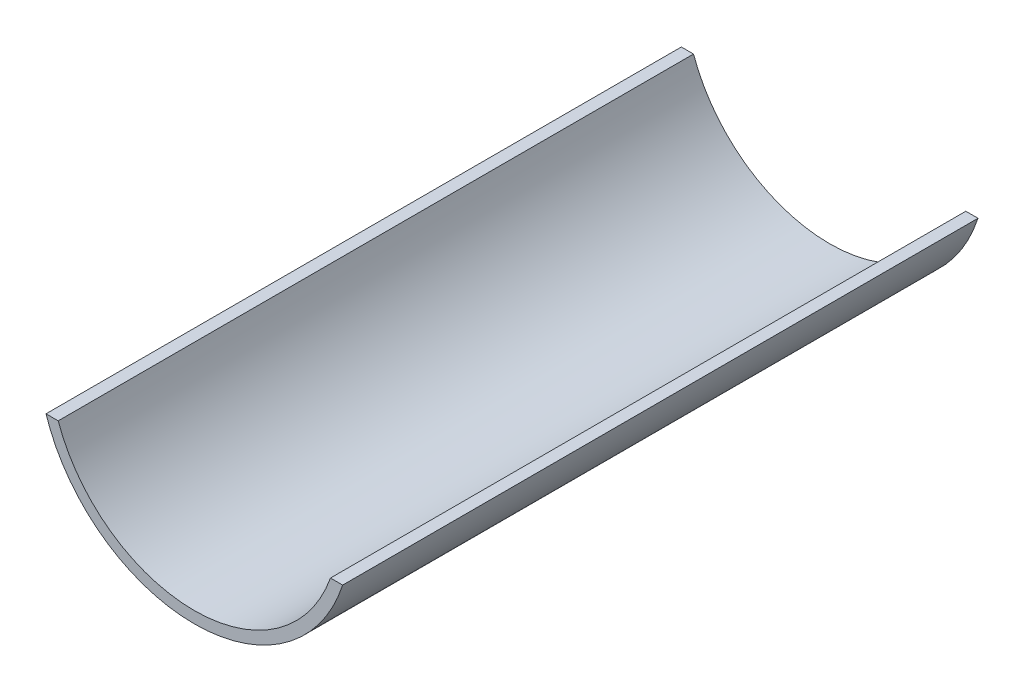
ISO-10303-21;
HEADER;
FILE_DESCRIPTION(('STEP AP214'),'2;1');
FILE_NAME('part.step','',(''),(''),'','','');
FILE_SCHEMA(('AUTOMOTIVE_DESIGN { 1 0 10303 214 1 1 1 1 }'));
ENDSEC;
DATA;
#1=APPLICATION_CONTEXT('core data for automotive mechanical design processes');
#2=APPLICATION_PROTOCOL_DEFINITION('international standard','automotive_design',2000,#1);
#3=PRODUCT_CONTEXT('',#1,'mechanical');
#4=PRODUCT('Part','Part','',(#3));
#5=PRODUCT_RELATED_PRODUCT_CATEGORY('part','',(#4));
#6=PRODUCT_DEFINITION_FORMATION('','',#4);
#7=PRODUCT_DEFINITION_CONTEXT('part definition',#1,'design');
#8=PRODUCT_DEFINITION('design','',#6,#7);
#9=PRODUCT_DEFINITION_SHAPE('','',#8);
#10=(LENGTH_UNIT() NAMED_UNIT(*) SI_UNIT(.MILLI.,.METRE.));
#11=(NAMED_UNIT(*) PLANE_ANGLE_UNIT() SI_UNIT($,.RADIAN.));
#12=(NAMED_UNIT(*) SI_UNIT($,.STERADIAN.) SOLID_ANGLE_UNIT());
#13=UNCERTAINTY_MEASURE_WITH_UNIT(LENGTH_MEASURE(1.E-05),#10,'distance_accuracy_value','');
#14=(GEOMETRIC_REPRESENTATION_CONTEXT(3) GLOBAL_UNCERTAINTY_ASSIGNED_CONTEXT((#13)) GLOBAL_UNIT_ASSIGNED_CONTEXT((#10,
#11,#12)) REPRESENTATION_CONTEXT('',''));
#15=CARTESIAN_POINT('',(0.,0.,0.));
#16=DIRECTION('',(0.,0.,1.));
#17=DIRECTION('',(1.,0.,0.));
#18=AXIS2_PLACEMENT_3D('',#15,#16,#17);
#19=CARTESIAN_POINT('',(0.,0.,330.));
#20=DIRECTION('',(0.,0.,-1.));
#21=DIRECTION('',(-1.,0.,0.));
#22=AXIS2_PLACEMENT_3D('',#19,#20,#21);
#23=CYLINDRICAL_SURFACE('',#22,75.);
#24=CARTESIAN_POINT('',(0.,0.,0.));
#25=DIRECTION('',(0.,0.,-1.));
#26=DIRECTION('',(1.,0.,0.));
#27=AXIS2_PLACEMENT_3D('',#24,#25,#26);
#28=CIRCLE('',#27,75.);
#29=CARTESIAN_POINT('',(70.7106781186548,-25.,0.));
#30=VERTEX_POINT('',#29);
#31=CARTESIAN_POINT('',(-70.7106781186548,-25.,0.));
#32=VERTEX_POINT('',#31);
#33=EDGE_CURVE('E111',#30,#32,#28,.T.);
#34=ORIENTED_EDGE('',*,*,#33,.T.);
#35=DIRECTION('',(0.,0.,-1.));
#36=VECTOR('',#35,1.);
#37=CARTESIAN_POINT('',(-70.7106781186548,-25.,330.));
#38=LINE('',#37,#36);
#39=CARTESIAN_POINT('',(-70.7106781186548,-25.,330.));
#40=VERTEX_POINT('',#39);
#41=EDGE_CURVE('E11',#40,#32,#38,.T.);
#42=ORIENTED_EDGE('',*,*,#41,.F.);
#43=CARTESIAN_POINT('',(0.,0.,330.));
#44=DIRECTION('',(0.,0.,-1.));
#45=DIRECTION('',(1.,0.,0.));
#46=AXIS2_PLACEMENT_3D('',#43,#44,#45);
#47=CIRCLE('',#46,75.);
#48=CARTESIAN_POINT('',(70.7106781186548,-25.,330.));
#49=VERTEX_POINT('',#48);
#50=EDGE_CURVE('E95',#49,#40,#47,.T.);
#51=ORIENTED_EDGE('',*,*,#50,.F.);
#52=DIRECTION('',(0.,0.,-1.));
#53=VECTOR('',#52,1.);
#54=CARTESIAN_POINT('',(70.7106781186548,-25.,330.));
#55=LINE('',#54,#53);
#56=EDGE_CURVE('E107',#49,#30,#55,.T.);
#57=ORIENTED_EDGE('',*,*,#56,.T.);
#58=EDGE_LOOP('',(#34,#42,#51,#57));
#59=FACE_BOUND('',#58,.T.);
#60=ADVANCED_FACE('F43',(#59),#23,.F.);
#61=CARTESIAN_POINT('',(-70.7106781186548,-25.,330.));
#62=DIRECTION('',(0.,-1.,0.));
#63=DIRECTION('',(1.,0.,0.));
#64=AXIS2_PLACEMENT_3D('',#61,#62,#63);
#65=PLANE('',#64);
#66=DIRECTION('',(-1.,0.,0.));
#67=VECTOR('',#66,1.);
#68=CARTESIAN_POINT('',(-70.7106781186548,-25.,0.));
#69=LINE('',#68,#67);
#70=CARTESIAN_POINT('',(-77.0454411370329,-25.,0.));
#71=VERTEX_POINT('',#70);
#72=EDGE_CURVE('E100',#32,#71,#69,.T.);
#73=ORIENTED_EDGE('',*,*,#72,.T.);
#74=DIRECTION('',(0.,0.,-1.));
#75=VECTOR('',#74,1.);
#76=CARTESIAN_POINT('',(-77.0454411370329,-25.,330.));
#77=LINE('',#76,#75);
#78=CARTESIAN_POINT('',(-77.0454411370329,-25.,330.));
#79=VERTEX_POINT('',#78);
#80=EDGE_CURVE('E52',#79,#71,#77,.T.);
#81=ORIENTED_EDGE('',*,*,#80,.F.);
#82=DIRECTION('',(-1.,0.,0.));
#83=VECTOR('',#82,1.);
#84=CARTESIAN_POINT('',(-70.7106781186548,-25.,330.));
#85=LINE('',#84,#83);
#86=EDGE_CURVE('E90',#40,#79,#85,.T.);
#87=ORIENTED_EDGE('',*,*,#86,.F.);
#88=ORIENTED_EDGE('',*,*,#41,.T.);
#89=EDGE_LOOP('',(#73,#81,#87,#88));
#90=FACE_BOUND('',#89,.T.);
#91=ADVANCED_FACE('F99',(#90),#65,.F.);
#92=CARTESIAN_POINT('',(0.,0.,330.));
#93=DIRECTION('',(0.,0.,-1.));
#94=DIRECTION('',(-1.,0.,0.));
#95=AXIS2_PLACEMENT_3D('',#92,#93,#94);
#96=CYLINDRICAL_SURFACE('',#95,81.);
#97=CARTESIAN_POINT('',(0.,0.,0.));
#98=DIRECTION('',(0.,0.,1.));
#99=DIRECTION('',(1.,0.,0.));
#100=AXIS2_PLACEMENT_3D('',#97,#98,#99);
#101=CIRCLE('',#100,81.);
#102=CARTESIAN_POINT('',(77.0454411370329,-25.,0.));
#103=VERTEX_POINT('',#102);
#104=EDGE_CURVE('E77',#71,#103,#101,.T.);
#105=ORIENTED_EDGE('',*,*,#104,.T.);
#106=DIRECTION('',(0.,0.,-1.));
#107=VECTOR('',#106,1.);
#108=CARTESIAN_POINT('',(77.0454411370329,-25.,330.));
#109=LINE('',#108,#107);
#110=CARTESIAN_POINT('',(77.0454411370329,-25.,330.));
#111=VERTEX_POINT('',#110);
#112=EDGE_CURVE('E102',#111,#103,#109,.T.);
#113=ORIENTED_EDGE('',*,*,#112,.F.);
#114=CARTESIAN_POINT('',(0.,0.,330.));
#115=DIRECTION('',(0.,0.,1.));
#116=DIRECTION('',(1.,0.,0.));
#117=AXIS2_PLACEMENT_3D('',#114,#115,#116);
#118=CIRCLE('',#117,81.);
#119=EDGE_CURVE('E93',#79,#111,#118,.T.);
#120=ORIENTED_EDGE('',*,*,#119,.F.);
#121=ORIENTED_EDGE('',*,*,#80,.T.);
#122=EDGE_LOOP('',(#105,#113,#120,#121));
#123=FACE_BOUND('',#122,.T.);
#124=ADVANCED_FACE('F103',(#123),#96,.T.);
#125=CARTESIAN_POINT('',(77.0454411370329,-25.,330.));
#126=DIRECTION('',(0.,-1.,0.));
#127=DIRECTION('',(1.,0.,0.));
#128=AXIS2_PLACEMENT_3D('',#125,#126,#127);
#129=PLANE('',#128);
#130=DIRECTION('',(-1.,0.,0.));
#131=VECTOR('',#130,1.);
#132=CARTESIAN_POINT('',(77.0454411370329,-25.,0.));
#133=LINE('',#132,#131);
#134=EDGE_CURVE('E83',#103,#30,#133,.T.);
#135=ORIENTED_EDGE('',*,*,#134,.T.);
#136=ORIENTED_EDGE('',*,*,#56,.F.);
#137=DIRECTION('',(-1.,0.,0.));
#138=VECTOR('',#137,1.);
#139=CARTESIAN_POINT('',(77.0454411370329,-25.,330.));
#140=LINE('',#139,#138);
#141=EDGE_CURVE('E60',#111,#49,#140,.T.);
#142=ORIENTED_EDGE('',*,*,#141,.F.);
#143=ORIENTED_EDGE('',*,*,#112,.T.);
#144=EDGE_LOOP('',(#135,#136,#142,#143));
#145=FACE_BOUND('',#144,.T.);
#146=ADVANCED_FACE('F124',(#145),#129,.F.);
#147=CARTESIAN_POINT('',(0.,0.,330.));
#148=DIRECTION('',(0.,0.,1.));
#149=DIRECTION('',(1.,0.,0.));
#150=AXIS2_PLACEMENT_3D('',#147,#148,#149);
#151=PLANE('',#150);
#152=ORIENTED_EDGE('',*,*,#50,.T.);
#153=ORIENTED_EDGE('',*,*,#86,.T.);
#154=ORIENTED_EDGE('',*,*,#119,.T.);
#155=ORIENTED_EDGE('',*,*,#141,.T.);
#156=EDGE_LOOP('',(#152,#153,#154,#155));
#157=FACE_BOUND('',#156,.T.);
#158=ADVANCED_FACE('F91',(#157),#151,.T.);
#159=CARTESIAN_POINT('',(0.,0.,0.));
#160=DIRECTION('',(0.,0.,1.));
#161=DIRECTION('',(1.,0.,0.));
#162=AXIS2_PLACEMENT_3D('',#159,#160,#161);
#163=PLANE('',#162);
#164=ORIENTED_EDGE('',*,*,#33,.F.);
#165=ORIENTED_EDGE('',*,*,#134,.F.);
#166=ORIENTED_EDGE('',*,*,#104,.F.);
#167=ORIENTED_EDGE('',*,*,#72,.F.);
#168=EDGE_LOOP('',(#164,#165,#166,#167));
#169=FACE_BOUND('',#168,.T.);
#170=ADVANCED_FACE('F127',(#169),#163,.F.);
#171=CLOSED_SHELL('',(#60,#91,#124,#146,#158,#170));
#172=MANIFOLD_SOLID_BREP('B2',#171);
#173=ADVANCED_BREP_SHAPE_REPRESENTATION('',(#18,#172),#14);
#174=SHAPE_DEFINITION_REPRESENTATION(#9,#173);
ENDSEC;
END-ISO-10303-21;
